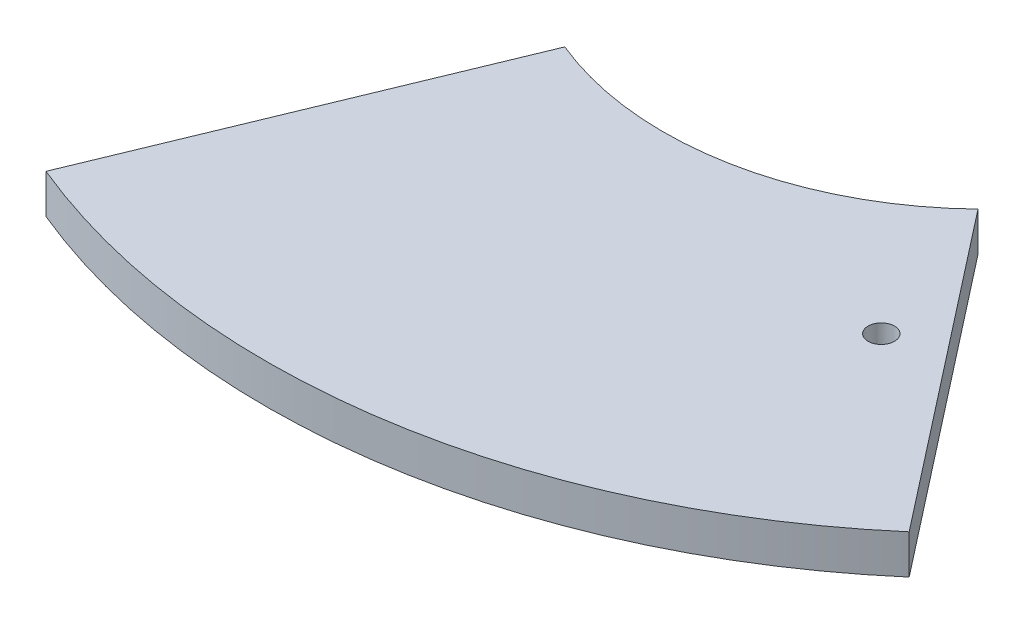
ISO-10303-21;
HEADER;
FILE_DESCRIPTION(('STEP AP214'),'2;1');
FILE_NAME('part.step','',(''),(''),'','','');
FILE_SCHEMA(('AUTOMOTIVE_DESIGN { 1 0 10303 214 1 1 1 1 }'));
ENDSEC;
DATA;
#1=APPLICATION_CONTEXT('core data for automotive mechanical design processes');
#2=APPLICATION_PROTOCOL_DEFINITION('international standard','automotive_design',2000,#1);
#3=PRODUCT_CONTEXT('',#1,'mechanical');
#4=PRODUCT('Part','Part','',(#3));
#5=PRODUCT_RELATED_PRODUCT_CATEGORY('part','',(#4));
#6=PRODUCT_DEFINITION_FORMATION('','',#4);
#7=PRODUCT_DEFINITION_CONTEXT('part definition',#1,'design');
#8=PRODUCT_DEFINITION('design','',#6,#7);
#9=PRODUCT_DEFINITION_SHAPE('','',#8);
#10=(LENGTH_UNIT() NAMED_UNIT(*) SI_UNIT(.MILLI.,.METRE.));
#11=(NAMED_UNIT(*) PLANE_ANGLE_UNIT() SI_UNIT($,.RADIAN.));
#12=(NAMED_UNIT(*) SI_UNIT($,.STERADIAN.) SOLID_ANGLE_UNIT());
#13=UNCERTAINTY_MEASURE_WITH_UNIT(LENGTH_MEASURE(1.E-05),#10,'distance_accuracy_value','');
#14=(GEOMETRIC_REPRESENTATION_CONTEXT(3) GLOBAL_UNCERTAINTY_ASSIGNED_CONTEXT((#13)) GLOBAL_UNIT_ASSIGNED_CONTEXT((#10,
#11,#12)) REPRESENTATION_CONTEXT('',''));
#15=CARTESIAN_POINT('',(0.,0.,0.));
#16=DIRECTION('',(0.,0.,1.));
#17=DIRECTION('',(1.,0.,0.));
#18=AXIS2_PLACEMENT_3D('',#15,#16,#17);
#19=CARTESIAN_POINT('',(0.,10.,0.));
#20=DIRECTION('',(0.,1.,0.));
#21=DIRECTION('',(0.,0.,1.));
#22=AXIS2_PLACEMENT_3D('',#19,#20,#21);
#23=PLANE('',#22);
#24=CARTESIAN_POINT('',(72.2972662907961,10.,98.9485463481805));
#25=DIRECTION('',(0.,1.,0.));
#26=DIRECTION('',(0.,0.,1.));
#27=AXIS2_PLACEMENT_3D('',#24,#25,#26);
#28=CIRCLE('',#27,3.37024184997162);
#29=CARTESIAN_POINT('',(72.2972662907961,10.,102.318788198152));
#30=VERTEX_POINT('',#29);
#31=EDGE_CURVE('E102',#30,#30,#28,.T.);
#32=ORIENTED_EDGE('',*,*,#31,.F.);
#33=EDGE_LOOP('',(#32));
#34=FACE_BOUND('',#33,.T.);
#35=DIRECTION('',(0.381735027157878,0.,-0.92427180474186));
#36=VECTOR('',#35,1.);
#37=CARTESIAN_POINT('',(-72.5296551599969,10.,175.611642900953));
#38=LINE('',#37,#36);
#39=CARTESIAN_POINT('',(-70.0419557412734,10.,169.588327596309));
#40=VERTEX_POINT('',#39);
#41=CARTESIAN_POINT('',(-31.3776355403961,10.,75.9727605962127));
#42=VERTEX_POINT('',#41);
#43=EDGE_CURVE('E113',#40,#42,#38,.T.);
#44=ORIENTED_EDGE('',*,*,#43,.F.);
#45=CARTESIAN_POINT('',(0.,10.,0.));
#46=DIRECTION('',(0.,1.,0.));
#47=DIRECTION('',(0.,0.,1.));
#48=AXIS2_PLACEMENT_3D('',#45,#46,#47);
#49=CIRCLE('',#48,183.48317748768);
#50=CARTESIAN_POINT('',(119.599097245866,10.,139.14787946264));
#51=VERTEX_POINT('',#50);
#52=EDGE_CURVE('E56',#40,#51,#49,.T.);
#53=ORIENTED_EDGE('',*,*,#52,.T.);
#54=DIRECTION('',(0.615382196014187,0.,0.788228870841938));
#55=VECTOR('',#54,1.);
#56=CARTESIAN_POINT('',(168.785470640045,10.,202.149571439458));
#57=LINE('',#56,#55);
#58=CARTESIAN_POINT('',(57.1146025399749,10.,59.1129304079579));
#59=VERTEX_POINT('',#58);
#60=EDGE_CURVE('E92',#59,#51,#57,.T.);
#61=ORIENTED_EDGE('',*,*,#60,.F.);
#62=CARTESIAN_POINT('',(0.,10.,0.));
#63=DIRECTION('',(0.,1.,0.));
#64=DIRECTION('',(0.,0.,1.));
#65=AXIS2_PLACEMENT_3D('',#62,#63,#64);
#66=CIRCLE('',#65,82.1974231026458);
#67=EDGE_CURVE('E97',#42,#59,#66,.T.);
#68=ORIENTED_EDGE('',*,*,#67,.F.);
#69=EDGE_LOOP('',(#44,#53,#61,#68));
#70=FACE_BOUND('',#69,.T.);
#71=ADVANCED_FACE('F41',(#34,#70),#23,.T.);
#72=CARTESIAN_POINT('',(0.,0.,0.));
#73=DIRECTION('',(0.,1.,0.));
#74=DIRECTION('',(0.,0.,1.));
#75=AXIS2_PLACEMENT_3D('',#72,#73,#74);
#76=PLANE('',#75);
#77=CARTESIAN_POINT('',(72.2972662907961,0.,98.9485463481805));
#78=DIRECTION('',(0.,1.,0.));
#79=DIRECTION('',(0.,0.,1.));
#80=AXIS2_PLACEMENT_3D('',#77,#78,#79);
#81=CIRCLE('',#80,3.37024184997162);
#82=CARTESIAN_POINT('',(72.2972662907961,0.,102.318788198152));
#83=VERTEX_POINT('',#82);
#84=EDGE_CURVE('E99',#83,#83,#81,.T.);
#85=ORIENTED_EDGE('',*,*,#84,.T.);
#86=EDGE_LOOP('',(#85));
#87=FACE_BOUND('',#86,.T.);
#88=CARTESIAN_POINT('',(0.,0.,0.));
#89=DIRECTION('',(0.,-1.,0.));
#90=DIRECTION('',(0.,0.,-1.));
#91=AXIS2_PLACEMENT_3D('',#88,#89,#90);
#92=CIRCLE('',#91,183.48317748768);
#93=CARTESIAN_POINT('',(119.599097245866,0.,139.14787946264));
#94=VERTEX_POINT('',#93);
#95=CARTESIAN_POINT('',(-70.0419557412735,0.,169.588327596309));
#96=VERTEX_POINT('',#95);
#97=EDGE_CURVE('E79',#94,#96,#92,.T.);
#98=ORIENTED_EDGE('',*,*,#97,.T.);
#99=DIRECTION('',(0.381735027157878,0.,-0.92427180474186));
#100=VECTOR('',#99,1.);
#101=CARTESIAN_POINT('',(-72.5296551599969,0.,175.611642900953));
#102=LINE('',#101,#100);
#103=CARTESIAN_POINT('',(-31.3776355403961,0.,75.9727605962127));
#104=VERTEX_POINT('',#103);
#105=EDGE_CURVE('E93',#96,#104,#102,.T.);
#106=ORIENTED_EDGE('',*,*,#105,.T.);
#107=CARTESIAN_POINT('',(0.,0.,0.));
#108=DIRECTION('',(0.,1.,0.));
#109=DIRECTION('',(0.,0.,1.));
#110=AXIS2_PLACEMENT_3D('',#107,#108,#109);
#111=CIRCLE('',#110,82.1974231026458);
#112=CARTESIAN_POINT('',(57.1146025399749,0.,59.1129304079579));
#113=VERTEX_POINT('',#112);
#114=EDGE_CURVE('E49',#104,#113,#111,.T.);
#115=ORIENTED_EDGE('',*,*,#114,.T.);
#116=DIRECTION('',(0.615382196014187,0.,0.788228870841938));
#117=VECTOR('',#116,1.);
#118=CARTESIAN_POINT('',(168.785470640045,0.,202.149571439458));
#119=LINE('',#118,#117);
#120=EDGE_CURVE('E89',#113,#94,#119,.T.);
#121=ORIENTED_EDGE('',*,*,#120,.T.);
#122=EDGE_LOOP('',(#98,#106,#115,#121));
#123=FACE_BOUND('',#122,.T.);
#124=ADVANCED_FACE('F43',(#87,#123),#76,.F.);
#125=CARTESIAN_POINT('',(168.785470640045,0.,202.149571439458));
#126=DIRECTION('',(-0.788228870841938,0.,0.615382196014187));
#127=DIRECTION('',(0.615382196014187,0.,0.788228870841938));
#128=AXIS2_PLACEMENT_3D('',#125,#126,#127);
#129=PLANE('',#128);
#130=DIRECTION('',(0.,-1.,0.));
#131=VECTOR('',#130,1.);
#132=CARTESIAN_POINT('',(119.599097245866,20.,139.14787946264));
#133=LINE('',#132,#131);
#134=EDGE_CURVE('E82',#94,#51,#133,.F.);
#135=ORIENTED_EDGE('',*,*,#134,.F.);
#136=ORIENTED_EDGE('',*,*,#120,.F.);
#137=DIRECTION('',(0.,1.,0.));
#138=VECTOR('',#137,1.);
#139=CARTESIAN_POINT('',(57.1146025399749,0.,59.1129304079579));
#140=LINE('',#139,#138);
#141=EDGE_CURVE('E95',#59,#113,#140,.F.);
#142=ORIENTED_EDGE('',*,*,#141,.F.);
#143=ORIENTED_EDGE('',*,*,#60,.T.);
#144=EDGE_LOOP('',(#135,#136,#142,#143));
#145=FACE_BOUND('',#144,.T.);
#146=ADVANCED_FACE('F87',(#145),#129,.F.);
#147=CARTESIAN_POINT('',(-72.5296551599969,10.,175.611642900953));
#148=DIRECTION('',(-0.92427180474186,0.,-0.381735027157878));
#149=DIRECTION('',(-0.381735027157878,0.,0.92427180474186));
#150=AXIS2_PLACEMENT_3D('',#147,#148,#149);
#151=PLANE('',#150);
#152=ORIENTED_EDGE('',*,*,#105,.F.);
#153=DIRECTION('',(0.,-1.,0.));
#154=VECTOR('',#153,1.);
#155=CARTESIAN_POINT('',(-70.0419557412735,20.,169.588327596309));
#156=LINE('',#155,#154);
#157=EDGE_CURVE('E11',#96,#40,#156,.F.);
#158=ORIENTED_EDGE('',*,*,#157,.T.);
#159=ORIENTED_EDGE('',*,*,#43,.T.);
#160=DIRECTION('',(0.,-1.,0.));
#161=VECTOR('',#160,1.);
#162=CARTESIAN_POINT('',(-31.3776355403961,10.,75.9727605962127));
#163=LINE('',#162,#161);
#164=EDGE_CURVE('E110',#42,#104,#163,.T.);
#165=ORIENTED_EDGE('',*,*,#164,.T.);
#166=EDGE_LOOP('',(#152,#158,#159,#165));
#167=FACE_BOUND('',#166,.T.);
#168=ADVANCED_FACE('F133',(#167),#151,.T.);
#169=CARTESIAN_POINT('',(0.,0.,0.));
#170=DIRECTION('',(0.,1.,0.));
#171=DIRECTION('',(0.,0.,1.));
#172=AXIS2_PLACEMENT_3D('',#169,#170,#171);
#173=CYLINDRICAL_SURFACE('',#172,82.1974231026458);
#174=ORIENTED_EDGE('',*,*,#114,.F.);
#175=ORIENTED_EDGE('',*,*,#164,.F.);
#176=ORIENTED_EDGE('',*,*,#67,.T.);
#177=ORIENTED_EDGE('',*,*,#141,.T.);
#178=EDGE_LOOP('',(#174,#175,#176,#177));
#179=FACE_BOUND('',#178,.T.);
#180=ADVANCED_FACE('F108',(#179),#173,.F.);
#181=CARTESIAN_POINT('',(72.2972662907961,0.,98.9485463481805));
#182=DIRECTION('',(0.,1.,0.));
#183=DIRECTION('',(0.,0.,1.));
#184=AXIS2_PLACEMENT_3D('',#181,#182,#183);
#185=CYLINDRICAL_SURFACE('',#184,3.37024184997162);
#186=ORIENTED_EDGE('',*,*,#84,.F.);
#187=EDGE_LOOP('',(#186));
#188=FACE_BOUND('',#187,.T.);
#189=ORIENTED_EDGE('',*,*,#31,.T.);
#190=EDGE_LOOP('',(#189));
#191=FACE_BOUND('',#190,.T.);
#192=ADVANCED_FACE('F124',(#188,#191),#185,.F.);
#193=CARTESIAN_POINT('',(0.,20.,0.));
#194=DIRECTION('',(0.,-1.,0.));
#195=DIRECTION('',(0.,0.,-1.));
#196=AXIS2_PLACEMENT_3D('',#193,#194,#195);
#197=CYLINDRICAL_SURFACE('',#196,183.48317748768);
#198=ORIENTED_EDGE('',*,*,#134,.T.);
#199=ORIENTED_EDGE('',*,*,#52,.F.);
#200=ORIENTED_EDGE('',*,*,#157,.F.);
#201=ORIENTED_EDGE('',*,*,#97,.F.);
#202=EDGE_LOOP('',(#198,#199,#200,#201));
#203=FACE_BOUND('',#202,.T.);
#204=ADVANCED_FACE('F81',(#203),#197,.T.);
#205=CLOSED_SHELL('',(#71,#124,#146,#168,#180,#192,#204));
#206=MANIFOLD_SOLID_BREP('B2',#205);
#207=ADVANCED_BREP_SHAPE_REPRESENTATION('',(#18,#206),#14);
#208=SHAPE_DEFINITION_REPRESENTATION(#9,#207);
ENDSEC;
END-ISO-10303-21;
